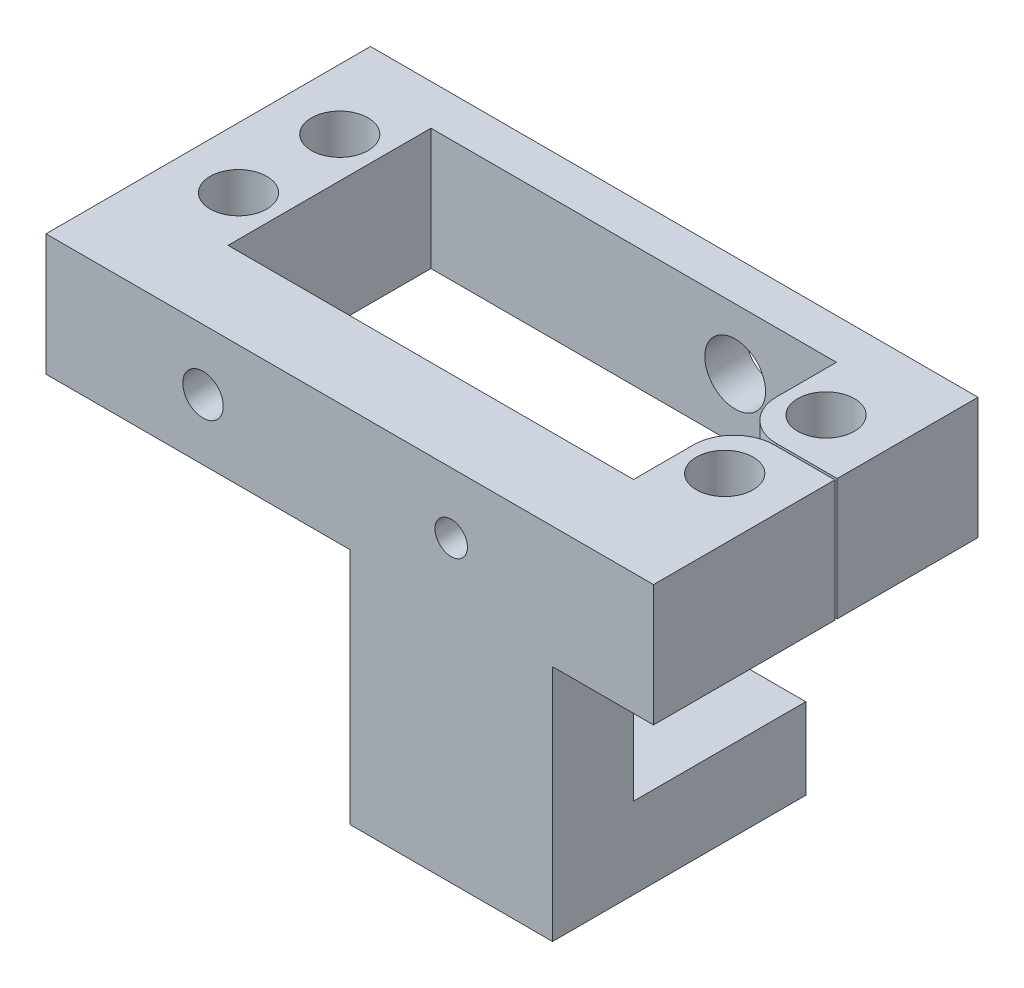
ISO-10303-21;
HEADER;
FILE_DESCRIPTION(('STEP AP214'),'2;1');
FILE_NAME('part.step','',(''),(''),'','','');
FILE_SCHEMA(('AUTOMOTIVE_DESIGN { 1 0 10303 214 1 1 1 1 }'));
ENDSEC;
DATA;
#1=APPLICATION_CONTEXT('core data for automotive mechanical design processes');
#2=APPLICATION_PROTOCOL_DEFINITION('international standard','automotive_design',2000,#1);
#3=PRODUCT_CONTEXT('',#1,'mechanical');
#4=PRODUCT('Part','Part','',(#3));
#5=PRODUCT_RELATED_PRODUCT_CATEGORY('part','',(#4));
#6=PRODUCT_DEFINITION_FORMATION('','',#4);
#7=PRODUCT_DEFINITION_CONTEXT('part definition',#1,'design');
#8=PRODUCT_DEFINITION('design','',#6,#7);
#9=PRODUCT_DEFINITION_SHAPE('','',#8);
#10=(LENGTH_UNIT() NAMED_UNIT(*) SI_UNIT(.MILLI.,.METRE.));
#11=(NAMED_UNIT(*) PLANE_ANGLE_UNIT() SI_UNIT($,.RADIAN.));
#12=(NAMED_UNIT(*) SI_UNIT($,.STERADIAN.) SOLID_ANGLE_UNIT());
#13=UNCERTAINTY_MEASURE_WITH_UNIT(LENGTH_MEASURE(1.E-05),#10,'distance_accuracy_value','');
#14=(GEOMETRIC_REPRESENTATION_CONTEXT(3) GLOBAL_UNCERTAINTY_ASSIGNED_CONTEXT((#13)) GLOBAL_UNIT_ASSIGNED_CONTEXT((#10,
#11,#12)) REPRESENTATION_CONTEXT('',''));
#15=CARTESIAN_POINT('',(0.,0.,0.));
#16=DIRECTION('',(0.,0.,1.));
#17=DIRECTION('',(1.,0.,0.));
#18=AXIS2_PLACEMENT_3D('',#15,#16,#17);
#19=CARTESIAN_POINT('',(0.,-6.,0.));
#20=DIRECTION('',(0.,1.,0.));
#21=DIRECTION('',(0.,0.,1.));
#22=AXIS2_PLACEMENT_3D('',#19,#20,#21);
#23=PLANE('',#22);
#24=DIRECTION('',(1.,0.,0.));
#25=VECTOR('',#24,1.);
#26=CARTESIAN_POINT('',(0.,-6.,18.015));
#27=LINE('',#26,#25);
#28=CARTESIAN_POINT('',(20.015,-6.,18.015));
#29=VERTEX_POINT('',#28);
#30=CARTESIAN_POINT('',(29.985,-6.,18.015));
#31=VERTEX_POINT('',#30);
#32=EDGE_CURVE('E200',#29,#31,#27,.T.);
#33=ORIENTED_EDGE('',*,*,#32,.F.);
#34=DIRECTION('',(0.,0.,-1.));
#35=VECTOR('',#34,1.);
#36=CARTESIAN_POINT('',(20.015,-6.,18.015));
#37=LINE('',#36,#35);
#38=CARTESIAN_POINT('',(20.015,-6.,10.015));
#39=VERTEX_POINT('',#38);
#40=EDGE_CURVE('E380',#29,#39,#37,.T.);
#41=ORIENTED_EDGE('',*,*,#40,.T.);
#42=DIRECTION('',(0.,0.,-1.));
#43=VECTOR('',#42,1.);
#44=CARTESIAN_POINT('',(20.015,-6.,0.));
#45=LINE('',#44,#43);
#46=CARTESIAN_POINT('',(20.015,-6.,4.1));
#47=VERTEX_POINT('',#46);
#48=EDGE_CURVE('E213',#39,#47,#45,.T.);
#49=ORIENTED_EDGE('',*,*,#48,.T.);
#50=CARTESIAN_POINT('',(24.,-6.,4.1));
#51=DIRECTION('',(0.,1.,0.));
#52=DIRECTION('',(0.,0.,1.));
#53=AXIS2_PLACEMENT_3D('',#50,#51,#52);
#54=CIRCLE('',#53,3.985);
#55=CARTESIAN_POINT('',(24.,-6.,0.115000000000004));
#56=VERTEX_POINT('',#55);
#57=EDGE_CURVE('E210',#47,#56,#54,.F.);
#58=ORIENTED_EDGE('',*,*,#57,.T.);
#59=DIRECTION('',(-1.,0.,0.));
#60=VECTOR('',#59,1.);
#61=CARTESIAN_POINT('',(0.,-6.,0.115000000000002));
#62=LINE('',#61,#60);
#63=CARTESIAN_POINT('',(29.985,-6.,0.115000000000006));
#64=VERTEX_POINT('',#63);
#65=EDGE_CURVE('E207',#64,#56,#62,.T.);
#66=ORIENTED_EDGE('',*,*,#65,.F.);
#67=DIRECTION('',(0.,0.,-1.));
#68=VECTOR('',#67,1.);
#69=CARTESIAN_POINT('',(29.985,-6.,0.));
#70=LINE('',#69,#68);
#71=EDGE_CURVE('E205',#31,#64,#70,.T.);
#72=ORIENTED_EDGE('',*,*,#71,.F.);
#73=EDGE_LOOP('',(#33,#41,#49,#58,#66,#72));
#74=FACE_BOUND('',#73,.T.);
#75=ADVANCED_FACE('F41',(#74),#23,.F.);
#76=CARTESIAN_POINT('',(10.015,0.,8.015));
#77=DIRECTION('',(0.,0.,1.));
#78=DIRECTION('',(1.,0.,0.));
#79=AXIS2_PLACEMENT_3D('',#76,#77,#78);
#80=CYLINDRICAL_SURFACE('',#79,1.6);
#81=CARTESIAN_POINT('',(10.015,0.,18.015));
#82=DIRECTION('',(0.,0.,1.));
#83=DIRECTION('',(1.,0.,0.));
#84=AXIS2_PLACEMENT_3D('',#81,#82,#83);
#85=CIRCLE('',#84,1.6);
#86=CARTESIAN_POINT('',(11.615,0.,18.015));
#87=VERTEX_POINT('',#86);
#88=EDGE_CURVE('E201',#87,#87,#85,.T.);
#89=ORIENTED_EDGE('',*,*,#88,.T.);
#90=EDGE_LOOP('',(#89));
#91=FACE_BOUND('',#90,.T.);
#92=CARTESIAN_POINT('',(10.015,0.,14.015));
#93=DIRECTION('',(0.,0.,-1.));
#94=DIRECTION('',(-1.,0.,0.));
#95=AXIS2_PLACEMENT_3D('',#92,#93,#94);
#96=CIRCLE('',#95,1.6);
#97=CARTESIAN_POINT('',(8.415,0.,14.015));
#98=VERTEX_POINT('',#97);
#99=EDGE_CURVE('E45',#98,#98,#96,.F.);
#100=ORIENTED_EDGE('',*,*,#99,.F.);
#101=EDGE_LOOP('',(#100));
#102=FACE_BOUND('',#101,.T.);
#103=ADVANCED_FACE('F301',(#91,#102),#80,.F.);
#104=CARTESIAN_POINT('',(-29.985,6.,0.));
#105=DIRECTION('',(1.,0.,0.));
#106=DIRECTION('',(0.,0.,-1.));
#107=AXIS2_PLACEMENT_3D('',#104,#105,#106);
#108=PLANE('',#107);
#109=DIRECTION('',(0.,0.,1.));
#110=VECTOR('',#109,1.);
#111=CARTESIAN_POINT('',(-29.985,-6.,0.));
#112=LINE('',#111,#110);
#113=CARTESIAN_POINT('',(-29.985,-6.,-14.015));
#114=VERTEX_POINT('',#113);
#115=CARTESIAN_POINT('',(-29.985,-6.,18.015));
#116=VERTEX_POINT('',#115);
#117=EDGE_CURVE('E197',#114,#116,#112,.T.);
#118=ORIENTED_EDGE('',*,*,#117,.T.);
#119=DIRECTION('',(0.,-1.,0.));
#120=VECTOR('',#119,1.);
#121=CARTESIAN_POINT('',(-29.985,6.,18.015));
#122=LINE('',#121,#120);
#123=CARTESIAN_POINT('',(-29.985,6.,18.015));
#124=VERTEX_POINT('',#123);
#125=EDGE_CURVE('E258',#124,#116,#122,.T.);
#126=ORIENTED_EDGE('',*,*,#125,.F.);
#127=DIRECTION('',(0.,0.,1.));
#128=VECTOR('',#127,1.);
#129=CARTESIAN_POINT('',(-29.985,6.,0.));
#130=LINE('',#129,#128);
#131=CARTESIAN_POINT('',(-29.985,6.,-14.015));
#132=VERTEX_POINT('',#131);
#133=EDGE_CURVE('E232',#132,#124,#130,.T.);
#134=ORIENTED_EDGE('',*,*,#133,.F.);
#135=DIRECTION('',(0.,-1.,0.));
#136=VECTOR('',#135,1.);
#137=CARTESIAN_POINT('',(-29.985,6.,-14.015));
#138=LINE('',#137,#136);
#139=EDGE_CURVE('E196',#132,#114,#138,.T.);
#140=ORIENTED_EDGE('',*,*,#139,.T.);
#141=EDGE_LOOP('',(#118,#126,#134,#140));
#142=FACE_BOUND('',#141,.T.);
#143=ADVANCED_FACE('F43',(#142),#108,.F.);
#144=CARTESIAN_POINT('',(0.,6.,18.015));
#145=DIRECTION('',(0.,0.,-1.));
#146=DIRECTION('',(-1.,0.,0.));
#147=AXIS2_PLACEMENT_3D('',#144,#145,#146);
#148=PLANE('',#147);
#149=CARTESIAN_POINT('',(-14.485,0.,18.015));
#150=DIRECTION('',(0.,0.,-1.));
#151=DIRECTION('',(-1.,0.,0.));
#152=AXIS2_PLACEMENT_3D('',#149,#150,#151);
#153=CIRCLE('',#152,2.);
#154=CARTESIAN_POINT('',(-16.485,0.,18.015));
#155=VERTEX_POINT('',#154);
#156=EDGE_CURVE('E424',#155,#155,#153,.F.);
#157=ORIENTED_EDGE('',*,*,#156,.F.);
#158=EDGE_LOOP('',(#157));
#159=FACE_BOUND('',#158,.T.);
#160=ORIENTED_EDGE('',*,*,#88,.F.);
#161=EDGE_LOOP('',(#160));
#162=FACE_BOUND('',#161,.T.);
#163=CARTESIAN_POINT('',(0.,-6.,18.015));
#164=VERTEX_POINT('',#163);
#165=EDGE_CURVE('E202',#116,#164,#27,.T.);
#166=ORIENTED_EDGE('',*,*,#165,.T.);
#167=DIRECTION('',(0.,-1.,0.));
#168=VECTOR('',#167,1.);
#169=CARTESIAN_POINT('',(0.,-29.5,18.015));
#170=LINE('',#169,#168);
#171=CARTESIAN_POINT('',(0.,-29.5,18.015));
#172=VERTEX_POINT('',#171);
#173=EDGE_CURVE('E57',#164,#172,#170,.T.);
#174=ORIENTED_EDGE('',*,*,#173,.T.);
#175=DIRECTION('',(-1.,0.,0.));
#176=VECTOR('',#175,1.);
#177=CARTESIAN_POINT('',(54.3260769285955,-29.5,18.015));
#178=LINE('',#177,#176);
#179=CARTESIAN_POINT('',(20.015,-29.5,18.015));
#180=VERTEX_POINT('',#179);
#181=EDGE_CURVE('E384',#180,#172,#178,.T.);
#182=ORIENTED_EDGE('',*,*,#181,.F.);
#183=DIRECTION('',(0.,1.,0.));
#184=VECTOR('',#183,1.);
#185=CARTESIAN_POINT('',(20.015,-29.5,18.015));
#186=LINE('',#185,#184);
#187=EDGE_CURVE('E379',#180,#29,#186,.T.);
#188=ORIENTED_EDGE('',*,*,#187,.T.);
#189=ORIENTED_EDGE('',*,*,#32,.T.);
#190=DIRECTION('',(0.,-1.,0.));
#191=VECTOR('',#190,1.);
#192=CARTESIAN_POINT('',(29.985,6.,18.015));
#193=LINE('',#192,#191);
#194=CARTESIAN_POINT('',(29.985,6.,18.015));
#195=VERTEX_POINT('',#194);
#196=EDGE_CURVE('E255',#195,#31,#193,.T.);
#197=ORIENTED_EDGE('',*,*,#196,.F.);
#198=DIRECTION('',(1.,0.,0.));
#199=VECTOR('',#198,1.);
#200=CARTESIAN_POINT('',(0.,6.,18.015));
#201=LINE('',#200,#199);
#202=EDGE_CURVE('E123',#124,#195,#201,.T.);
#203=ORIENTED_EDGE('',*,*,#202,.F.);
#204=ORIENTED_EDGE('',*,*,#125,.T.);
#205=EDGE_LOOP('',(#166,#174,#182,#188,#189,#197,#203,#204));
#206=FACE_BOUND('',#205,.T.);
#207=ADVANCED_FACE('F442',(#159,#162,#206),#148,.F.);
#208=CARTESIAN_POINT('',(29.985,6.,0.));
#209=DIRECTION('',(-1.,0.,0.));
#210=DIRECTION('',(0.,0.,1.));
#211=AXIS2_PLACEMENT_3D('',#208,#209,#210);
#212=PLANE('',#211);
#213=ORIENTED_EDGE('',*,*,#71,.T.);
#214=DIRECTION('',(0.,-1.,0.));
#215=VECTOR('',#214,1.);
#216=CARTESIAN_POINT('',(29.985,6.,0.115000000000006));
#217=LINE('',#216,#215);
#218=CARTESIAN_POINT('',(29.985,6.,0.115000000000006));
#219=VERTEX_POINT('',#218);
#220=EDGE_CURVE('E252',#219,#64,#217,.T.);
#221=ORIENTED_EDGE('',*,*,#220,.F.);
#222=DIRECTION('',(0.,0.,-1.));
#223=VECTOR('',#222,1.);
#224=CARTESIAN_POINT('',(29.985,6.,0.));
#225=LINE('',#224,#223);
#226=EDGE_CURVE('E359',#195,#219,#225,.T.);
#227=ORIENTED_EDGE('',*,*,#226,.F.);
#228=ORIENTED_EDGE('',*,*,#196,.T.);
#229=EDGE_LOOP('',(#213,#221,#227,#228));
#230=FACE_BOUND('',#229,.T.);
#231=ADVANCED_FACE('F445',(#230),#212,.F.);
#232=CARTESIAN_POINT('',(0.,6.,0.115000000000002));
#233=DIRECTION('',(0.,0.,1.));
#234=DIRECTION('',(1.,0.,0.));
#235=AXIS2_PLACEMENT_3D('',#232,#233,#234);
#236=PLANE('',#235);
#237=ORIENTED_EDGE('',*,*,#65,.T.);
#238=DIRECTION('',(0.,-1.,0.));
#239=VECTOR('',#238,1.);
#240=CARTESIAN_POINT('',(24.,6.,0.115000000000004));
#241=LINE('',#240,#239);
#242=CARTESIAN_POINT('',(24.,6.,0.115000000000004));
#243=VERTEX_POINT('',#242);
#244=EDGE_CURVE('E250',#243,#56,#241,.T.);
#245=ORIENTED_EDGE('',*,*,#244,.F.);
#246=DIRECTION('',(-1.,0.,0.));
#247=VECTOR('',#246,1.);
#248=CARTESIAN_POINT('',(0.,6.,0.115000000000002));
#249=LINE('',#248,#247);
#250=EDGE_CURVE('E356',#219,#243,#249,.T.);
#251=ORIENTED_EDGE('',*,*,#250,.F.);
#252=ORIENTED_EDGE('',*,*,#220,.T.);
#253=EDGE_LOOP('',(#237,#245,#251,#252));
#254=FACE_BOUND('',#253,.T.);
#255=ADVANCED_FACE('F461',(#254),#236,.F.);
#256=CARTESIAN_POINT('',(24.,6.,4.1));
#257=DIRECTION('',(0.,-1.,0.));
#258=DIRECTION('',(0.,0.,-1.));
#259=AXIS2_PLACEMENT_3D('',#256,#257,#258);
#260=CYLINDRICAL_SURFACE('',#259,3.985);
#261=ORIENTED_EDGE('',*,*,#57,.F.);
#262=DIRECTION('',(0.,-1.,0.));
#263=VECTOR('',#262,1.);
#264=CARTESIAN_POINT('',(20.015,6.,4.1));
#265=LINE('',#264,#263);
#266=CARTESIAN_POINT('',(20.015,6.,4.1));
#267=VERTEX_POINT('',#266);
#268=EDGE_CURVE('E248',#267,#47,#265,.T.);
#269=ORIENTED_EDGE('',*,*,#268,.F.);
#270=CARTESIAN_POINT('',(24.,6.,4.1));
#271=DIRECTION('',(0.,1.,0.));
#272=DIRECTION('',(0.,0.,1.));
#273=AXIS2_PLACEMENT_3D('',#270,#271,#272);
#274=CIRCLE('',#273,3.985);
#275=EDGE_CURVE('E352',#267,#243,#274,.F.);
#276=ORIENTED_EDGE('',*,*,#275,.T.);
#277=ORIENTED_EDGE('',*,*,#244,.T.);
#278=EDGE_LOOP('',(#261,#269,#276,#277));
#279=FACE_BOUND('',#278,.T.);
#280=ADVANCED_FACE('F561',(#279),#260,.T.);
#281=CARTESIAN_POINT('',(20.015,6.,0.));
#282=DIRECTION('',(-1.,0.,0.));
#283=DIRECTION('',(0.,0.,1.));
#284=AXIS2_PLACEMENT_3D('',#281,#282,#283);
#285=PLANE('',#284);
#286=ORIENTED_EDGE('',*,*,#48,.F.);
#287=DIRECTION('',(0.,-1.,0.));
#288=VECTOR('',#287,1.);
#289=CARTESIAN_POINT('',(20.015,6.,10.015));
#290=LINE('',#289,#288);
#291=CARTESIAN_POINT('',(20.015,6.,10.015));
#292=VERTEX_POINT('',#291);
#293=EDGE_CURVE('E245',#292,#39,#290,.T.);
#294=ORIENTED_EDGE('',*,*,#293,.F.);
#295=DIRECTION('',(0.,0.,-1.));
#296=VECTOR('',#295,1.);
#297=CARTESIAN_POINT('',(20.015,6.,0.));
#298=LINE('',#297,#296);
#299=EDGE_CURVE('E345',#292,#267,#298,.T.);
#300=ORIENTED_EDGE('',*,*,#299,.T.);
#301=ORIENTED_EDGE('',*,*,#268,.T.);
#302=EDGE_LOOP('',(#286,#294,#300,#301));
#303=FACE_BOUND('',#302,.T.);
#304=ADVANCED_FACE('F467',(#303),#285,.T.);
#305=CARTESIAN_POINT('',(0.,6.,10.015));
#306=DIRECTION('',(0.,0.,1.));
#307=DIRECTION('',(1.,0.,0.));
#308=AXIS2_PLACEMENT_3D('',#305,#306,#307);
#309=PLANE('',#308);
#310=CARTESIAN_POINT('',(-14.485,0.,10.015));
#311=DIRECTION('',(0.,0.,1.));
#312=DIRECTION('',(1.,0.,0.));
#313=AXIS2_PLACEMENT_3D('',#310,#311,#312);
#314=CIRCLE('',#313,2.);
#315=CARTESIAN_POINT('',(-16.485,0.,10.015));
#316=VERTEX_POINT('',#315);
#317=EDGE_CURVE('E429',#316,#316,#314,.T.);
#318=ORIENTED_EDGE('',*,*,#317,.T.);
#319=EDGE_LOOP('',(#318));
#320=FACE_BOUND('',#319,.T.);
#321=CARTESIAN_POINT('',(10.015,0.,10.015));
#322=DIRECTION('',(0.,0.,1.));
#323=DIRECTION('',(1.,0.,0.));
#324=AXIS2_PLACEMENT_3D('',#321,#322,#323);
#325=CIRCLE('',#324,3.);
#326=CARTESIAN_POINT('',(13.015,0.,10.015));
#327=VERTEX_POINT('',#326);
#328=EDGE_CURVE('E367',#327,#327,#325,.T.);
#329=ORIENTED_EDGE('',*,*,#328,.T.);
#330=EDGE_LOOP('',(#329));
#331=FACE_BOUND('',#330,.T.);
#332=ORIENTED_EDGE('',*,*,#293,.T.);
#333=DIRECTION('',(0.,-1.,0.));
#334=VECTOR('',#333,1.);
#335=CARTESIAN_POINT('',(20.015,-6.,10.015));
#336=LINE('',#335,#334);
#337=CARTESIAN_POINT('',(20.015,-21.5,10.015));
#338=VERTEX_POINT('',#337);
#339=EDGE_CURVE('E383',#39,#338,#336,.T.);
#340=ORIENTED_EDGE('',*,*,#339,.T.);
#341=DIRECTION('',(-1.,0.,0.));
#342=VECTOR('',#341,1.);
#343=CARTESIAN_POINT('',(54.3260769285955,-21.5,10.015));
#344=LINE('',#343,#342);
#345=CARTESIAN_POINT('',(0.,-21.5,10.015));
#346=VERTEX_POINT('',#345);
#347=EDGE_CURVE('E393',#338,#346,#344,.T.);
#348=ORIENTED_EDGE('',*,*,#347,.T.);
#349=DIRECTION('',(0.,1.,0.));
#350=VECTOR('',#349,1.);
#351=CARTESIAN_POINT('',(0.,-6.,10.015));
#352=LINE('',#351,#350);
#353=CARTESIAN_POINT('',(0.,-6.,10.015));
#354=VERTEX_POINT('',#353);
#355=EDGE_CURVE('E333',#346,#354,#352,.T.);
#356=ORIENTED_EDGE('',*,*,#355,.T.);
#357=DIRECTION('',(-1.,0.,0.));
#358=VECTOR('',#357,1.);
#359=CARTESIAN_POINT('',(0.,-6.,10.015));
#360=LINE('',#359,#358);
#361=CARTESIAN_POINT('',(-20.015,-6.,10.015));
#362=VERTEX_POINT('',#361);
#363=EDGE_CURVE('E216',#354,#362,#360,.T.);
#364=ORIENTED_EDGE('',*,*,#363,.T.);
#365=DIRECTION('',(0.,-1.,0.));
#366=VECTOR('',#365,1.);
#367=CARTESIAN_POINT('',(-20.015,6.,10.015));
#368=LINE('',#367,#366);
#369=CARTESIAN_POINT('',(-20.015,6.,10.015));
#370=VERTEX_POINT('',#369);
#371=EDGE_CURVE('E242',#370,#362,#368,.T.);
#372=ORIENTED_EDGE('',*,*,#371,.F.);
#373=DIRECTION('',(-1.,0.,0.));
#374=VECTOR('',#373,1.);
#375=CARTESIAN_POINT('',(0.,6.,10.015));
#376=LINE('',#375,#374);
#377=EDGE_CURVE('E341',#292,#370,#376,.T.);
#378=ORIENTED_EDGE('',*,*,#377,.F.);
#379=EDGE_LOOP('',(#332,#340,#348,#356,#364,#372,#378));
#380=FACE_BOUND('',#379,.T.);
#381=ADVANCED_FACE('F328',(#320,#331,#380),#309,.F.);
#382=CARTESIAN_POINT('',(-20.015,6.,0.));
#383=DIRECTION('',(-1.,0.,0.));
#384=DIRECTION('',(0.,0.,1.));
#385=AXIS2_PLACEMENT_3D('',#382,#383,#384);
#386=PLANE('',#385);
#387=DIRECTION('',(0.,0.,-1.));
#388=VECTOR('',#387,1.);
#389=CARTESIAN_POINT('',(-20.015,-6.,0.));
#390=LINE('',#389,#388);
#391=CARTESIAN_POINT('',(-20.015,-6.,-10.015));
#392=VERTEX_POINT('',#391);
#393=EDGE_CURVE('E219',#362,#392,#390,.T.);
#394=ORIENTED_EDGE('',*,*,#393,.T.);
#395=DIRECTION('',(0.,-1.,0.));
#396=VECTOR('',#395,1.);
#397=CARTESIAN_POINT('',(-20.015,6.,-10.015));
#398=LINE('',#397,#396);
#399=CARTESIAN_POINT('',(-20.015,6.,-10.015));
#400=VERTEX_POINT('',#399);
#401=EDGE_CURVE('E240',#400,#392,#398,.T.);
#402=ORIENTED_EDGE('',*,*,#401,.F.);
#403=DIRECTION('',(0.,0.,-1.));
#404=VECTOR('',#403,1.);
#405=CARTESIAN_POINT('',(-20.015,6.,0.));
#406=LINE('',#405,#404);
#407=EDGE_CURVE('E337',#370,#400,#406,.T.);
#408=ORIENTED_EDGE('',*,*,#407,.F.);
#409=ORIENTED_EDGE('',*,*,#371,.T.);
#410=EDGE_LOOP('',(#394,#402,#408,#409));
#411=FACE_BOUND('',#410,.T.);
#412=ADVANCED_FACE('F335',(#411),#386,.F.);
#413=CARTESIAN_POINT('',(0.,6.,-10.015));
#414=DIRECTION('',(0.,0.,1.));
#415=DIRECTION('',(1.,0.,0.));
#416=AXIS2_PLACEMENT_3D('',#413,#414,#415);
#417=PLANE('',#416);
#418=CARTESIAN_POINT('',(10.015,0.,-10.015));
#419=DIRECTION('',(0.,0.,1.));
#420=DIRECTION('',(1.,0.,0.));
#421=AXIS2_PLACEMENT_3D('',#418,#419,#420);
#422=CIRCLE('',#421,3.);
#423=CARTESIAN_POINT('',(13.015,0.,-10.015));
#424=VERTEX_POINT('',#423);
#425=EDGE_CURVE('E370',#424,#424,#422,.T.);
#426=ORIENTED_EDGE('',*,*,#425,.F.);
#427=EDGE_LOOP('',(#426));
#428=FACE_BOUND('',#427,.T.);
#429=DIRECTION('',(-1.,0.,0.));
#430=VECTOR('',#429,1.);
#431=CARTESIAN_POINT('',(0.,-6.,-10.015));
#432=LINE('',#431,#430);
#433=CARTESIAN_POINT('',(20.015,-6.,-10.015));
#434=VERTEX_POINT('',#433);
#435=EDGE_CURVE('E222',#434,#392,#432,.T.);
#436=ORIENTED_EDGE('',*,*,#435,.F.);
#437=DIRECTION('',(0.,-1.,0.));
#438=VECTOR('',#437,1.);
#439=CARTESIAN_POINT('',(20.015,6.,-10.015));
#440=LINE('',#439,#438);
#441=CARTESIAN_POINT('',(20.015,6.,-10.015));
#442=VERTEX_POINT('',#441);
#443=EDGE_CURVE('E238',#442,#434,#440,.T.);
#444=ORIENTED_EDGE('',*,*,#443,.F.);
#445=DIRECTION('',(-1.,0.,0.));
#446=VECTOR('',#445,1.);
#447=CARTESIAN_POINT('',(0.,6.,-10.015));
#448=LINE('',#447,#446);
#449=EDGE_CURVE('E340',#442,#400,#448,.T.);
#450=ORIENTED_EDGE('',*,*,#449,.T.);
#451=ORIENTED_EDGE('',*,*,#401,.T.);
#452=EDGE_LOOP('',(#436,#444,#450,#451));
#453=FACE_BOUND('',#452,.T.);
#454=ADVANCED_FACE('F553',(#428,#453),#417,.T.);
#455=CARTESIAN_POINT('',(20.015,-6.,-4.1));
#456=VERTEX_POINT('',#455);
#457=EDGE_CURVE('E217',#456,#434,#45,.T.);
#458=ORIENTED_EDGE('',*,*,#457,.F.);
#459=DIRECTION('',(0.,-1.,0.));
#460=VECTOR('',#459,1.);
#461=CARTESIAN_POINT('',(20.015,6.,-4.1));
#462=LINE('',#461,#460);
#463=CARTESIAN_POINT('',(20.015,6.,-4.1));
#464=VERTEX_POINT('',#463);
#465=EDGE_CURVE('E236',#464,#456,#462,.T.);
#466=ORIENTED_EDGE('',*,*,#465,.F.);
#467=EDGE_CURVE('E343',#464,#442,#298,.T.);
#468=ORIENTED_EDGE('',*,*,#467,.T.);
#469=ORIENTED_EDGE('',*,*,#443,.T.);
#470=EDGE_LOOP('',(#458,#466,#468,#469));
#471=FACE_BOUND('',#470,.T.);
#472=ADVANCED_FACE('F549',(#471),#285,.T.);
#473=CARTESIAN_POINT('',(24.,6.,-4.1));
#474=DIRECTION('',(0.,-1.,0.));
#475=DIRECTION('',(0.,0.,-1.));
#476=AXIS2_PLACEMENT_3D('',#473,#474,#475);
#477=CYLINDRICAL_SURFACE('',#476,3.985);
#478=CARTESIAN_POINT('',(24.,-6.,-4.1));
#479=DIRECTION('',(0.,1.,0.));
#480=DIRECTION('',(0.,0.,1.));
#481=AXIS2_PLACEMENT_3D('',#478,#479,#480);
#482=CIRCLE('',#481,3.985);
#483=CARTESIAN_POINT('',(24.,-6.,-0.115000000000005));
#484=VERTEX_POINT('',#483);
#485=EDGE_CURVE('E225',#456,#484,#482,.T.);
#486=ORIENTED_EDGE('',*,*,#485,.T.);
#487=DIRECTION('',(0.,-1.,0.));
#488=VECTOR('',#487,1.);
#489=CARTESIAN_POINT('',(24.,6.,-0.115000000000005));
#490=LINE('',#489,#488);
#491=CARTESIAN_POINT('',(24.,6.,-0.115000000000005));
#492=VERTEX_POINT('',#491);
#493=EDGE_CURVE('E168',#492,#484,#490,.T.);
#494=ORIENTED_EDGE('',*,*,#493,.F.);
#495=CARTESIAN_POINT('',(24.,6.,-4.1));
#496=DIRECTION('',(0.,1.,0.));
#497=DIRECTION('',(0.,0.,1.));
#498=AXIS2_PLACEMENT_3D('',#495,#496,#497);
#499=CIRCLE('',#498,3.985);
#500=EDGE_CURVE('E176',#464,#492,#499,.T.);
#501=ORIENTED_EDGE('',*,*,#500,.F.);
#502=ORIENTED_EDGE('',*,*,#465,.T.);
#503=EDGE_LOOP('',(#486,#494,#501,#502));
#504=FACE_BOUND('',#503,.T.);
#505=ADVANCED_FACE('F546',(#504),#477,.T.);
#506=CARTESIAN_POINT('',(0.,6.,-0.115000000000002));
#507=DIRECTION('',(0.,0.,1.));
#508=DIRECTION('',(1.,0.,0.));
#509=AXIS2_PLACEMENT_3D('',#506,#507,#508);
#510=PLANE('',#509);
#511=DIRECTION('',(-1.,0.,0.));
#512=VECTOR('',#511,1.);
#513=CARTESIAN_POINT('',(0.,-6.,-0.115000000000002));
#514=LINE('',#513,#512);
#515=CARTESIAN_POINT('',(29.985,-6.,-0.115000000000006));
#516=VERTEX_POINT('',#515);
#517=EDGE_CURVE('E163',#516,#484,#514,.T.);
#518=ORIENTED_EDGE('',*,*,#517,.F.);
#519=DIRECTION('',(0.,-1.,0.));
#520=VECTOR('',#519,1.);
#521=CARTESIAN_POINT('',(29.985,6.,-0.115000000000006));
#522=LINE('',#521,#520);
#523=CARTESIAN_POINT('',(29.985,6.,-0.115000000000006));
#524=VERTEX_POINT('',#523);
#525=EDGE_CURVE('E158',#524,#516,#522,.T.);
#526=ORIENTED_EDGE('',*,*,#525,.F.);
#527=DIRECTION('',(-1.,0.,0.));
#528=VECTOR('',#527,1.);
#529=CARTESIAN_POINT('',(0.,6.,-0.115000000000002));
#530=LINE('',#529,#528);
#531=EDGE_CURVE('E161',#524,#492,#530,.T.);
#532=ORIENTED_EDGE('',*,*,#531,.T.);
#533=ORIENTED_EDGE('',*,*,#493,.T.);
#534=EDGE_LOOP('',(#518,#526,#532,#533));
#535=FACE_BOUND('',#534,.T.);
#536=ADVANCED_FACE('F160',(#535),#510,.T.);
#537=CARTESIAN_POINT('',(29.985,6.,0.));
#538=DIRECTION('',(1.,0.,0.));
#539=DIRECTION('',(0.,0.,-1.));
#540=AXIS2_PLACEMENT_3D('',#537,#538,#539);
#541=PLANE('',#540);
#542=DIRECTION('',(0.,0.,1.));
#543=VECTOR('',#542,1.);
#544=CARTESIAN_POINT('',(29.985,-6.,0.));
#545=LINE('',#544,#543);
#546=CARTESIAN_POINT('',(29.985,-6.,-14.015));
#547=VERTEX_POINT('',#546);
#548=EDGE_CURVE('E229',#547,#516,#545,.T.);
#549=ORIENTED_EDGE('',*,*,#548,.F.);
#550=DIRECTION('',(0.,-1.,0.));
#551=VECTOR('',#550,1.);
#552=CARTESIAN_POINT('',(29.985,6.,-14.015));
#553=LINE('',#552,#551);
#554=CARTESIAN_POINT('',(29.985,6.,-14.015));
#555=VERTEX_POINT('',#554);
#556=EDGE_CURVE('E169',#555,#547,#553,.T.);
#557=ORIENTED_EDGE('',*,*,#556,.F.);
#558=DIRECTION('',(0.,0.,1.));
#559=VECTOR('',#558,1.);
#560=CARTESIAN_POINT('',(29.985,6.,0.));
#561=LINE('',#560,#559);
#562=EDGE_CURVE('E173',#555,#524,#561,.T.);
#563=ORIENTED_EDGE('',*,*,#562,.T.);
#564=ORIENTED_EDGE('',*,*,#525,.T.);
#565=EDGE_LOOP('',(#549,#557,#563,#564));
#566=FACE_BOUND('',#565,.T.);
#567=ADVANCED_FACE('F179',(#566),#541,.T.);
#568=CARTESIAN_POINT('',(24.,6.,5.));
#569=DIRECTION('',(0.,-1.,0.));
#570=DIRECTION('',(0.,0.,-1.));
#571=AXIS2_PLACEMENT_3D('',#568,#569,#570);
#572=CYLINDRICAL_SURFACE('',#571,2.8);
#573=CARTESIAN_POINT('',(24.,-2.5,5.));
#574=DIRECTION('',(0.,1.,0.));
#575=DIRECTION('',(0.,0.,1.));
#576=AXIS2_PLACEMENT_3D('',#573,#574,#575);
#577=CIRCLE('',#576,2.8);
#578=CARTESIAN_POINT('',(24.,-2.5,7.8));
#579=VERTEX_POINT('',#578);
#580=EDGE_CURVE('E263',#579,#579,#577,.T.);
#581=ORIENTED_EDGE('',*,*,#580,.F.);
#582=EDGE_LOOP('',(#581));
#583=FACE_BOUND('',#582,.T.);
#584=CARTESIAN_POINT('',(24.,6.,5.));
#585=DIRECTION('',(0.,1.,0.));
#586=DIRECTION('',(0.,0.,1.));
#587=AXIS2_PLACEMENT_3D('',#584,#585,#586);
#588=CIRCLE('',#587,2.8);
#589=CARTESIAN_POINT('',(24.,6.,7.8));
#590=VERTEX_POINT('',#589);
#591=EDGE_CURVE('E190',#590,#590,#588,.T.);
#592=ORIENTED_EDGE('',*,*,#591,.T.);
#593=EDGE_LOOP('',(#592));
#594=FACE_BOUND('',#593,.T.);
#595=ADVANCED_FACE('F533',(#583,#594),#572,.F.);
#596=CARTESIAN_POINT('',(-24.,6.,5.));
#597=DIRECTION('',(0.,-1.,0.));
#598=DIRECTION('',(0.,0.,-1.));
#599=AXIS2_PLACEMENT_3D('',#596,#597,#598);
#600=CYLINDRICAL_SURFACE('',#599,2.8);
#601=CARTESIAN_POINT('',(-24.,-2.5,5.));
#602=DIRECTION('',(0.,1.,0.));
#603=DIRECTION('',(0.,0.,1.));
#604=AXIS2_PLACEMENT_3D('',#601,#602,#603);
#605=CIRCLE('',#604,2.8);
#606=CARTESIAN_POINT('',(-24.,-2.5,7.8));
#607=VERTEX_POINT('',#606);
#608=EDGE_CURVE('E12',#607,#607,#605,.T.);
#609=ORIENTED_EDGE('',*,*,#608,.F.);
#610=EDGE_LOOP('',(#609));
#611=FACE_BOUND('',#610,.T.);
#612=CARTESIAN_POINT('',(-24.,6.,5.));
#613=DIRECTION('',(0.,1.,0.));
#614=DIRECTION('',(0.,0.,1.));
#615=AXIS2_PLACEMENT_3D('',#612,#613,#614);
#616=CIRCLE('',#615,2.8);
#617=CARTESIAN_POINT('',(-24.,6.,7.8));
#618=VERTEX_POINT('',#617);
#619=EDGE_CURVE('E187',#618,#618,#616,.T.);
#620=ORIENTED_EDGE('',*,*,#619,.T.);
#621=EDGE_LOOP('',(#620));
#622=FACE_BOUND('',#621,.T.);
#623=ADVANCED_FACE('F275',(#611,#622),#600,.F.);
#624=CARTESIAN_POINT('',(-24.,6.,-5.));
#625=DIRECTION('',(0.,-1.,0.));
#626=DIRECTION('',(0.,0.,-1.));
#627=AXIS2_PLACEMENT_3D('',#624,#625,#626);
#628=CYLINDRICAL_SURFACE('',#627,2.8);
#629=CARTESIAN_POINT('',(-24.,-2.5,-5.));
#630=DIRECTION('',(0.,1.,0.));
#631=DIRECTION('',(0.,0.,1.));
#632=AXIS2_PLACEMENT_3D('',#629,#630,#631);
#633=CIRCLE('',#632,2.8);
#634=CARTESIAN_POINT('',(-24.,-2.5,-2.2));
#635=VERTEX_POINT('',#634);
#636=EDGE_CURVE('E50',#635,#635,#633,.T.);
#637=ORIENTED_EDGE('',*,*,#636,.F.);
#638=EDGE_LOOP('',(#637));
#639=FACE_BOUND('',#638,.T.);
#640=CARTESIAN_POINT('',(-24.,6.,-5.));
#641=DIRECTION('',(0.,1.,0.));
#642=DIRECTION('',(0.,0.,1.));
#643=AXIS2_PLACEMENT_3D('',#640,#641,#642);
#644=CIRCLE('',#643,2.8);
#645=CARTESIAN_POINT('',(-24.,6.,-2.2));
#646=VERTEX_POINT('',#645);
#647=EDGE_CURVE('E181',#646,#646,#644,.T.);
#648=ORIENTED_EDGE('',*,*,#647,.T.);
#649=EDGE_LOOP('',(#648));
#650=FACE_BOUND('',#649,.T.);
#651=ADVANCED_FACE('F271',(#639,#650),#628,.F.);
#652=CARTESIAN_POINT('',(0.,6.,-14.015));
#653=DIRECTION('',(0.,0.,1.));
#654=DIRECTION('',(1.,0.,0.));
#655=AXIS2_PLACEMENT_3D('',#652,#653,#654);
#656=PLANE('',#655);
#657=CARTESIAN_POINT('',(10.015,0.,-14.015));
#658=DIRECTION('',(0.,0.,-1.));
#659=DIRECTION('',(-1.,0.,0.));
#660=AXIS2_PLACEMENT_3D('',#657,#658,#659);
#661=CIRCLE('',#660,3.);
#662=CARTESIAN_POINT('',(7.015,0.,-14.015));
#663=VERTEX_POINT('',#662);
#664=EDGE_CURVE('E376',#663,#663,#661,.T.);
#665=ORIENTED_EDGE('',*,*,#664,.F.);
#666=EDGE_LOOP('',(#665));
#667=FACE_BOUND('',#666,.T.);
#668=DIRECTION('',(-1.,0.,0.));
#669=VECTOR('',#668,1.);
#670=CARTESIAN_POINT('',(0.,-6.,-14.015));
#671=LINE('',#670,#669);
#672=EDGE_CURVE('E114',#547,#114,#671,.T.);
#673=ORIENTED_EDGE('',*,*,#672,.T.);
#674=ORIENTED_EDGE('',*,*,#139,.F.);
#675=DIRECTION('',(-1.,0.,0.));
#676=VECTOR('',#675,1.);
#677=CARTESIAN_POINT('',(0.,6.,-14.015));
#678=LINE('',#677,#676);
#679=EDGE_CURVE('E66',#555,#132,#678,.T.);
#680=ORIENTED_EDGE('',*,*,#679,.F.);
#681=ORIENTED_EDGE('',*,*,#556,.T.);
#682=EDGE_LOOP('',(#673,#674,#680,#681));
#683=FACE_BOUND('',#682,.T.);
#684=ADVANCED_FACE('F274',(#667,#683),#656,.F.);
#685=CARTESIAN_POINT('',(24.,6.,-5.));
#686=DIRECTION('',(0.,-1.,0.));
#687=DIRECTION('',(0.,0.,-1.));
#688=AXIS2_PLACEMENT_3D('',#685,#686,#687);
#689=CYLINDRICAL_SURFACE('',#688,2.8);
#690=CARTESIAN_POINT('',(24.,-2.5,-5.));
#691=DIRECTION('',(0.,1.,0.));
#692=DIRECTION('',(0.,0.,1.));
#693=AXIS2_PLACEMENT_3D('',#690,#691,#692);
#694=CIRCLE('',#693,2.8);
#695=CARTESIAN_POINT('',(24.,-2.5,-2.2));
#696=VERTEX_POINT('',#695);
#697=EDGE_CURVE('E260',#696,#696,#694,.T.);
#698=ORIENTED_EDGE('',*,*,#697,.F.);
#699=EDGE_LOOP('',(#698));
#700=FACE_BOUND('',#699,.T.);
#701=CARTESIAN_POINT('',(24.,6.,-5.));
#702=DIRECTION('',(0.,1.,0.));
#703=DIRECTION('',(0.,0.,1.));
#704=AXIS2_PLACEMENT_3D('',#701,#702,#703);
#705=CIRCLE('',#704,2.8);
#706=CARTESIAN_POINT('',(24.,6.,-2.2));
#707=VERTEX_POINT('',#706);
#708=EDGE_CURVE('E193',#707,#707,#705,.T.);
#709=ORIENTED_EDGE('',*,*,#708,.T.);
#710=EDGE_LOOP('',(#709));
#711=FACE_BOUND('',#710,.T.);
#712=ADVANCED_FACE('F281',(#700,#711),#689,.F.);
#713=CARTESIAN_POINT('',(0.,6.,0.));
#714=DIRECTION('',(0.,1.,0.));
#715=DIRECTION('',(0.,0.,1.));
#716=AXIS2_PLACEMENT_3D('',#713,#714,#715);
#717=PLANE('',#716);
#718=ORIENTED_EDGE('',*,*,#133,.T.);
#719=ORIENTED_EDGE('',*,*,#202,.T.);
#720=ORIENTED_EDGE('',*,*,#226,.T.);
#721=ORIENTED_EDGE('',*,*,#250,.T.);
#722=ORIENTED_EDGE('',*,*,#275,.F.);
#723=ORIENTED_EDGE('',*,*,#299,.F.);
#724=ORIENTED_EDGE('',*,*,#377,.T.);
#725=ORIENTED_EDGE('',*,*,#407,.T.);
#726=ORIENTED_EDGE('',*,*,#449,.F.);
#727=ORIENTED_EDGE('',*,*,#467,.F.);
#728=ORIENTED_EDGE('',*,*,#500,.T.);
#729=ORIENTED_EDGE('',*,*,#531,.F.);
#730=ORIENTED_EDGE('',*,*,#562,.F.);
#731=ORIENTED_EDGE('',*,*,#679,.T.);
#732=EDGE_LOOP('',(#718,#719,#720,#721,#722,#723,#724,#725,#726,#727,#728,#729,#730,#731));
#733=FACE_BOUND('',#732,.T.);
#734=ORIENTED_EDGE('',*,*,#647,.F.);
#735=EDGE_LOOP('',(#734));
#736=FACE_BOUND('',#735,.T.);
#737=ORIENTED_EDGE('',*,*,#619,.F.);
#738=EDGE_LOOP('',(#737));
#739=FACE_BOUND('',#738,.T.);
#740=ORIENTED_EDGE('',*,*,#591,.F.);
#741=EDGE_LOOP('',(#740));
#742=FACE_BOUND('',#741,.T.);
#743=ORIENTED_EDGE('',*,*,#708,.F.);
#744=EDGE_LOOP('',(#743));
#745=FACE_BOUND('',#744,.T.);
#746=ADVANCED_FACE('F171',(#733,#736,#739,#742,#745),#717,.T.);
#747=ORIENTED_EDGE('',*,*,#363,.F.);
#748=DIRECTION('',(0.,0.,1.));
#749=VECTOR('',#748,1.);
#750=CARTESIAN_POINT('',(0.,-6.,18.015));
#751=LINE('',#750,#749);
#752=EDGE_CURVE('E321',#354,#164,#751,.T.);
#753=ORIENTED_EDGE('',*,*,#752,.T.);
#754=ORIENTED_EDGE('',*,*,#165,.F.);
#755=ORIENTED_EDGE('',*,*,#117,.F.);
#756=ORIENTED_EDGE('',*,*,#672,.F.);
#757=ORIENTED_EDGE('',*,*,#548,.T.);
#758=ORIENTED_EDGE('',*,*,#517,.T.);
#759=ORIENTED_EDGE('',*,*,#485,.F.);
#760=ORIENTED_EDGE('',*,*,#457,.T.);
#761=ORIENTED_EDGE('',*,*,#435,.T.);
#762=ORIENTED_EDGE('',*,*,#393,.F.);
#763=EDGE_LOOP('',(#747,#753,#754,#755,#756,#757,#758,#759,#760,#761,#762));
#764=FACE_BOUND('',#763,.T.);
#765=ADVANCED_FACE('F280',(#764),#23,.F.);
#766=CARTESIAN_POINT('',(0.,-2.5,0.));
#767=DIRECTION('',(0.,1.,0.));
#768=DIRECTION('',(0.,0.,1.));
#769=AXIS2_PLACEMENT_3D('',#766,#767,#768);
#770=PLANE('',#769);
#771=ORIENTED_EDGE('',*,*,#697,.T.);
#772=EDGE_LOOP('',(#771));
#773=FACE_BOUND('',#772,.T.);
#774=ADVANCED_FACE('F310',(#773),#770,.T.);
#775=CARTESIAN_POINT('',(0.,-2.5,0.));
#776=DIRECTION('',(0.,1.,0.));
#777=DIRECTION('',(0.,0.,1.));
#778=AXIS2_PLACEMENT_3D('',#775,#776,#777);
#779=PLANE('',#778);
#780=ORIENTED_EDGE('',*,*,#580,.T.);
#781=EDGE_LOOP('',(#780));
#782=FACE_BOUND('',#781,.T.);
#783=ADVANCED_FACE('F315',(#782),#779,.T.);
#784=CARTESIAN_POINT('',(0.,-2.5,0.));
#785=DIRECTION('',(0.,1.,0.));
#786=DIRECTION('',(0.,0.,1.));
#787=AXIS2_PLACEMENT_3D('',#784,#785,#786);
#788=PLANE('',#787);
#789=ORIENTED_EDGE('',*,*,#636,.T.);
#790=EDGE_LOOP('',(#789));
#791=FACE_BOUND('',#790,.T.);
#792=ADVANCED_FACE('F269',(#791),#788,.T.);
#793=CARTESIAN_POINT('',(0.,-2.5,0.));
#794=DIRECTION('',(0.,1.,0.));
#795=DIRECTION('',(0.,0.,1.));
#796=AXIS2_PLACEMENT_3D('',#793,#794,#795);
#797=PLANE('',#796);
#798=ORIENTED_EDGE('',*,*,#608,.T.);
#799=EDGE_LOOP('',(#798));
#800=FACE_BOUND('',#799,.T.);
#801=ADVANCED_FACE('F517',(#800),#797,.T.);
#802=CARTESIAN_POINT('',(0.,6.,14.015));
#803=DIRECTION('',(0.,0.,-1.));
#804=DIRECTION('',(-1.,0.,0.));
#805=AXIS2_PLACEMENT_3D('',#802,#803,#804);
#806=PLANE('',#805);
#807=CARTESIAN_POINT('',(10.015,0.,14.015));
#808=DIRECTION('',(0.,0.,-1.));
#809=DIRECTION('',(-1.,0.,0.));
#810=AXIS2_PLACEMENT_3D('',#807,#808,#809);
#811=CIRCLE('',#810,3.);
#812=CARTESIAN_POINT('',(7.015,0.,14.015));
#813=VERTEX_POINT('',#812);
#814=EDGE_CURVE('E373',#813,#813,#811,.F.);
#815=ORIENTED_EDGE('',*,*,#814,.F.);
#816=EDGE_LOOP('',(#815));
#817=FACE_BOUND('',#816,.T.);
#818=ORIENTED_EDGE('',*,*,#99,.T.);
#819=EDGE_LOOP('',(#818));
#820=FACE_BOUND('',#819,.T.);
#821=ADVANCED_FACE('F513',(#817,#820),#806,.T.);
#822=CARTESIAN_POINT('',(10.015,0.,26.5002813742386));
#823=DIRECTION('',(0.,0.,-1.));
#824=DIRECTION('',(-1.,0.,0.));
#825=AXIS2_PLACEMENT_3D('',#822,#823,#824);
#826=CYLINDRICAL_SURFACE('',#825,3.);
#827=ORIENTED_EDGE('',*,*,#814,.T.);
#828=EDGE_LOOP('',(#827));
#829=FACE_BOUND('',#828,.T.);
#830=ORIENTED_EDGE('',*,*,#328,.F.);
#831=EDGE_LOOP('',(#830));
#832=FACE_BOUND('',#831,.T.);
#833=ADVANCED_FACE('F516',(#829,#832),#826,.F.);
#834=ORIENTED_EDGE('',*,*,#425,.T.);
#835=EDGE_LOOP('',(#834));
#836=FACE_BOUND('',#835,.T.);
#837=ORIENTED_EDGE('',*,*,#664,.T.);
#838=EDGE_LOOP('',(#837));
#839=FACE_BOUND('',#838,.T.);
#840=ADVANCED_FACE('F506',(#836,#839),#826,.F.);
#841=CARTESIAN_POINT('',(0.,0.,0.));
#842=DIRECTION('',(-1.,0.,0.));
#843=DIRECTION('',(0.,0.,1.));
#844=AXIS2_PLACEMENT_3D('',#841,#842,#843);
#845=PLANE('',#844);
#846=ORIENTED_EDGE('',*,*,#173,.F.);
#847=ORIENTED_EDGE('',*,*,#752,.F.);
#848=ORIENTED_EDGE('',*,*,#355,.F.);
#849=DIRECTION('',(0.,0.,1.));
#850=VECTOR('',#849,1.);
#851=CARTESIAN_POINT('',(0.,-21.5,10.015));
#852=LINE('',#851,#850);
#853=CARTESIAN_POINT('',(0.,-21.5,-6.985));
#854=VERTEX_POINT('',#853);
#855=EDGE_CURVE('E397',#854,#346,#852,.T.);
#856=ORIENTED_EDGE('',*,*,#855,.F.);
#857=DIRECTION('',(0.,1.,0.));
#858=VECTOR('',#857,1.);
#859=CARTESIAN_POINT('',(0.,-21.5,-6.985));
#860=LINE('',#859,#858);
#861=CARTESIAN_POINT('',(0.,-29.5,-6.985));
#862=VERTEX_POINT('',#861);
#863=EDGE_CURVE('E400',#862,#854,#860,.T.);
#864=ORIENTED_EDGE('',*,*,#863,.F.);
#865=DIRECTION('',(0.,0.,-1.));
#866=VECTOR('',#865,1.);
#867=CARTESIAN_POINT('',(0.,-29.5,-6.985));
#868=LINE('',#867,#866);
#869=EDGE_CURVE('E403',#172,#862,#868,.T.);
#870=ORIENTED_EDGE('',*,*,#869,.F.);
#871=EDGE_LOOP('',(#846,#847,#848,#856,#864,#870));
#872=FACE_BOUND('',#871,.T.);
#873=ADVANCED_FACE('F495',(#872),#845,.T.);
#874=CARTESIAN_POINT('',(54.3260769285955,-21.5,10.015));
#875=DIRECTION('',(0.,-1.,0.));
#876=DIRECTION('',(0.,0.,-1.));
#877=AXIS2_PLACEMENT_3D('',#874,#875,#876);
#878=PLANE('',#877);
#879=ORIENTED_EDGE('',*,*,#347,.F.);
#880=DIRECTION('',(0.,0.,-1.));
#881=VECTOR('',#880,1.);
#882=CARTESIAN_POINT('',(20.015,-21.5,10.015));
#883=LINE('',#882,#881);
#884=CARTESIAN_POINT('',(20.015,-21.5,-6.98499999999999));
#885=VERTEX_POINT('',#884);
#886=EDGE_CURVE('E416',#338,#885,#883,.T.);
#887=ORIENTED_EDGE('',*,*,#886,.T.);
#888=DIRECTION('',(-1.,0.,0.));
#889=VECTOR('',#888,1.);
#890=CARTESIAN_POINT('',(54.3260769285955,-21.5,-6.985));
#891=LINE('',#890,#889);
#892=EDGE_CURVE('E390',#885,#854,#891,.T.);
#893=ORIENTED_EDGE('',*,*,#892,.T.);
#894=ORIENTED_EDGE('',*,*,#855,.T.);
#895=EDGE_LOOP('',(#879,#887,#893,#894));
#896=FACE_BOUND('',#895,.T.);
#897=ADVANCED_FACE('F498',(#896),#878,.F.);
#898=CARTESIAN_POINT('',(54.3260769285955,-21.5,-6.985));
#899=DIRECTION('',(0.,0.,1.));
#900=DIRECTION('',(0.,-1.,0.));
#901=AXIS2_PLACEMENT_3D('',#898,#899,#900);
#902=PLANE('',#901);
#903=ORIENTED_EDGE('',*,*,#892,.F.);
#904=DIRECTION('',(0.,-1.,0.));
#905=VECTOR('',#904,1.);
#906=CARTESIAN_POINT('',(20.015,-21.5,-6.985));
#907=LINE('',#906,#905);
#908=CARTESIAN_POINT('',(20.015,-29.5,-6.985));
#909=VERTEX_POINT('',#908);
#910=EDGE_CURVE('E413',#885,#909,#907,.T.);
#911=ORIENTED_EDGE('',*,*,#910,.T.);
#912=DIRECTION('',(-1.,0.,0.));
#913=VECTOR('',#912,1.);
#914=CARTESIAN_POINT('',(54.3260769285955,-29.5,-6.985));
#915=LINE('',#914,#913);
#916=EDGE_CURVE('E387',#909,#862,#915,.T.);
#917=ORIENTED_EDGE('',*,*,#916,.T.);
#918=ORIENTED_EDGE('',*,*,#863,.T.);
#919=EDGE_LOOP('',(#903,#911,#917,#918));
#920=FACE_BOUND('',#919,.T.);
#921=ADVANCED_FACE('F492',(#920),#902,.F.);
#922=CARTESIAN_POINT('',(54.3260769285955,-29.5,-6.985));
#923=DIRECTION('',(0.,1.,0.));
#924=DIRECTION('',(0.,0.,1.));
#925=AXIS2_PLACEMENT_3D('',#922,#923,#924);
#926=PLANE('',#925);
#927=CARTESIAN_POINT('',(10.015,-29.5,0.));
#928=DIRECTION('',(0.,-1.,0.));
#929=DIRECTION('',(0.,0.,-1.));
#930=AXIS2_PLACEMENT_3D('',#927,#928,#929);
#931=CIRCLE('',#930,2.);
#932=CARTESIAN_POINT('',(10.015,-29.5,-2.));
#933=VERTEX_POINT('',#932);
#934=EDGE_CURVE('E421',#933,#933,#931,.T.);
#935=ORIENTED_EDGE('',*,*,#934,.F.);
#936=EDGE_LOOP('',(#935));
#937=FACE_BOUND('',#936,.T.);
#938=ORIENTED_EDGE('',*,*,#916,.F.);
#939=DIRECTION('',(0.,0.,1.));
#940=VECTOR('',#939,1.);
#941=CARTESIAN_POINT('',(20.015,-29.5,-6.985));
#942=LINE('',#941,#940);
#943=EDGE_CURVE('E410',#909,#180,#942,.T.);
#944=ORIENTED_EDGE('',*,*,#943,.T.);
#945=ORIENTED_EDGE('',*,*,#181,.T.);
#946=ORIENTED_EDGE('',*,*,#869,.T.);
#947=EDGE_LOOP('',(#938,#944,#945,#946));
#948=FACE_BOUND('',#947,.T.);
#949=ADVANCED_FACE('F480',(#937,#948),#926,.F.);
#950=CARTESIAN_POINT('',(20.015,6.,0.));
#951=DIRECTION('',(-1.,0.,0.));
#952=DIRECTION('',(0.,0.,1.));
#953=AXIS2_PLACEMENT_3D('',#950,#951,#952);
#954=PLANE('',#953);
#955=ORIENTED_EDGE('',*,*,#943,.F.);
#956=ORIENTED_EDGE('',*,*,#910,.F.);
#957=ORIENTED_EDGE('',*,*,#886,.F.);
#958=ORIENTED_EDGE('',*,*,#339,.F.);
#959=ORIENTED_EDGE('',*,*,#40,.F.);
#960=ORIENTED_EDGE('',*,*,#187,.F.);
#961=EDGE_LOOP('',(#955,#956,#957,#958,#959,#960));
#962=FACE_BOUND('',#961,.T.);
#963=ADVANCED_FACE('F474',(#962),#954,.F.);
#964=CARTESIAN_POINT('',(10.015,-23.5,0.));
#965=DIRECTION('',(0.,-1.,0.));
#966=DIRECTION('',(0.,0.,-1.));
#967=AXIS2_PLACEMENT_3D('',#964,#965,#966);
#968=CYLINDRICAL_SURFACE('',#967,2.);
#969=CARTESIAN_POINT('',(10.015,-23.5,0.));
#970=DIRECTION('',(0.,-1.,0.));
#971=DIRECTION('',(0.,0.,-1.));
#972=AXIS2_PLACEMENT_3D('',#969,#970,#971);
#973=CIRCLE('',#972,2.);
#974=CARTESIAN_POINT('',(10.015,-23.5,-2.));
#975=VERTEX_POINT('',#974);
#976=EDGE_CURVE('E407',#975,#975,#973,.T.);
#977=ORIENTED_EDGE('',*,*,#976,.F.);
#978=EDGE_LOOP('',(#977));
#979=FACE_BOUND('',#978,.T.);
#980=ORIENTED_EDGE('',*,*,#934,.T.);
#981=EDGE_LOOP('',(#980));
#982=FACE_BOUND('',#981,.T.);
#983=ADVANCED_FACE('F751',(#979,#982),#968,.F.);
#984=CARTESIAN_POINT('',(10.015,-23.5,0.));
#985=DIRECTION('',(0.,-1.,0.));
#986=DIRECTION('',(0.,0.,-1.));
#987=AXIS2_PLACEMENT_3D('',#984,#985,#986);
#988=PLANE('',#987);
#989=ORIENTED_EDGE('',*,*,#976,.T.);
#990=EDGE_LOOP('',(#989));
#991=FACE_BOUND('',#990,.T.);
#992=ADVANCED_FACE('F438',(#991),#988,.T.);
#993=CARTESIAN_POINT('',(-14.485,0.,18.015012));
#994=DIRECTION('',(0.,0.,-1.));
#995=DIRECTION('',(-1.,0.,0.));
#996=AXIS2_PLACEMENT_3D('',#993,#994,#995);
#997=CYLINDRICAL_SURFACE('',#996,2.);
#998=CARTESIAN_POINT('',(-16.485,0.,10.015));
#999=CARTESIAN_POINT('',(-16.485,0.,10.0983333333333));
#1000=CARTESIAN_POINT('',(-16.485,0.,10.1816666666667));
#1001=CARTESIAN_POINT('',(-16.485,0.,10.3483333333333));
#1002=CARTESIAN_POINT('',(-16.485,0.,10.4316666666667));
#1003=CARTESIAN_POINT('',(-16.485,0.,10.5983333333333));
#1004=CARTESIAN_POINT('',(-16.485,0.,10.6816666666667));
#1005=CARTESIAN_POINT('',(-16.485,0.,10.8483333333333));
#1006=CARTESIAN_POINT('',(-16.485,0.,10.9316666666667));
#1007=CARTESIAN_POINT('',(-16.485,0.,11.0983333333333));
#1008=CARTESIAN_POINT('',(-16.485,0.,11.1816666666667));
#1009=CARTESIAN_POINT('',(-16.485,0.,11.3483333333333));
#1010=CARTESIAN_POINT('',(-16.485,0.,11.4316666666667));
#1011=CARTESIAN_POINT('',(-16.485,0.,11.5983333333333));
#1012=CARTESIAN_POINT('',(-16.485,0.,11.6816666666667));
#1013=CARTESIAN_POINT('',(-16.485,0.,11.8483333333333));
#1014=CARTESIAN_POINT('',(-16.485,0.,11.9316666666667));
#1015=CARTESIAN_POINT('',(-16.485,0.,12.0983333333333));
#1016=CARTESIAN_POINT('',(-16.485,0.,12.1816666666667));
#1017=CARTESIAN_POINT('',(-16.485,0.,12.3483333333333));
#1018=CARTESIAN_POINT('',(-16.485,0.,12.4316666666667));
#1019=CARTESIAN_POINT('',(-16.485,0.,12.5983333333333));
#1020=CARTESIAN_POINT('',(-16.485,0.,12.6816666666667));
#1021=CARTESIAN_POINT('',(-16.485,0.,12.8483333333333));
#1022=CARTESIAN_POINT('',(-16.485,0.,12.9316666666667));
#1023=CARTESIAN_POINT('',(-16.485,0.,13.0983333333333));
#1024=CARTESIAN_POINT('',(-16.485,0.,13.1816666666667));
#1025=CARTESIAN_POINT('',(-16.485,0.,13.3483333333333));
#1026=CARTESIAN_POINT('',(-16.485,0.,13.4316666666667));
#1027=CARTESIAN_POINT('',(-16.485,0.,13.5983333333333));
#1028=CARTESIAN_POINT('',(-16.485,0.,13.6816666666667));
#1029=CARTESIAN_POINT('',(-16.485,0.,13.8483333333333));
#1030=CARTESIAN_POINT('',(-16.485,0.,13.9316666666667));
#1031=CARTESIAN_POINT('',(-16.485,0.,14.0983333333333));
#1032=CARTESIAN_POINT('',(-16.485,0.,14.1816666666667));
#1033=CARTESIAN_POINT('',(-16.485,0.,14.3483333333333));
#1034=CARTESIAN_POINT('',(-16.485,0.,14.4316666666667));
#1035=CARTESIAN_POINT('',(-16.485,0.,14.5983333333333));
#1036=CARTESIAN_POINT('',(-16.485,0.,14.6816666666667));
#1037=CARTESIAN_POINT('',(-16.485,0.,14.8483333333333));
#1038=CARTESIAN_POINT('',(-16.485,0.,14.9316666666667));
#1039=CARTESIAN_POINT('',(-16.485,0.,15.0983333333333));
#1040=CARTESIAN_POINT('',(-16.485,0.,15.1816666666667));
#1041=CARTESIAN_POINT('',(-16.485,0.,15.3483333333333));
#1042=CARTESIAN_POINT('',(-16.485,0.,15.4316666666667));
#1043=CARTESIAN_POINT('',(-16.485,0.,15.5983333333333));
#1044=CARTESIAN_POINT('',(-16.485,0.,15.6816666666667));
#1045=CARTESIAN_POINT('',(-16.485,0.,15.8483333333333));
#1046=CARTESIAN_POINT('',(-16.485,0.,15.9316666666667));
#1047=CARTESIAN_POINT('',(-16.485,0.,16.0983333333333));
#1048=CARTESIAN_POINT('',(-16.485,0.,16.1816666666667));
#1049=CARTESIAN_POINT('',(-16.485,0.,16.3483333333333));
#1050=CARTESIAN_POINT('',(-16.485,0.,16.4316666666667));
#1051=CARTESIAN_POINT('',(-16.485,0.,16.5983333333333));
#1052=CARTESIAN_POINT('',(-16.485,0.,16.6816666666667));
#1053=CARTESIAN_POINT('',(-16.485,0.,16.8483333333333));
#1054=CARTESIAN_POINT('',(-16.485,0.,16.9316666666667));
#1055=CARTESIAN_POINT('',(-16.485,0.,17.0983333333333));
#1056=CARTESIAN_POINT('',(-16.485,0.,17.1816666666667));
#1057=CARTESIAN_POINT('',(-16.485,0.,17.3483333333333));
#1058=CARTESIAN_POINT('',(-16.485,0.,17.4316666666667));
#1059=CARTESIAN_POINT('',(-16.485,0.,17.5983333333333));
#1060=CARTESIAN_POINT('',(-16.485,0.,17.6816666666667));
#1061=CARTESIAN_POINT('',(-16.485,0.,17.8483333333333));
#1062=CARTESIAN_POINT('',(-16.485,0.,17.9316666666667));
#1063=CARTESIAN_POINT('',(-16.485,0.,18.015));
#1064=B_SPLINE_CURVE_WITH_KNOTS('',3,(#998,#999,#1000,#1001,#1002,#1003,#1004,#1005,#1006,#1007,
#1008,#1009,#1010,#1011,#1012,#1013,#1014,#1015,#1016,#1017,#1018,#1019,#1020,#1021,#1022,#1023,
#1024,#1025,#1026,#1027,#1028,#1029,#1030,#1031,#1032,#1033,#1034,#1035,#1036,#1037,#1038,#1039,
#1040,#1041,#1042,#1043,#1044,#1045,#1046,#1047,#1048,#1049,#1050,#1051,#1052,#1053,#1054,#1055,
#1056,#1057,#1058,#1059,#1060,#1061,#1062,#1063),.UNSPECIFIED.,.F.,.F.,(4,2,2,2,2,2,2,2,2,2,2,2,
2,2,2,2,2,2,2,2,2,2,2,2,2,2,2,2,2,2,2,2,4),(0.,0.249999999999999,0.499999999999999,
0.749999999999999,0.999999999999999,1.25,1.5,1.75,2.,2.25,2.5,2.75,3.,3.25,3.5,3.75,4.,4.25,4.5,
4.75,5.,5.25,5.5,5.75,6.,6.25,6.5,6.75,7.,7.25,7.50000000000001,7.75000000000001,
8.00000000000001),.UNSPECIFIED.);
#1065=EDGE_CURVE('BSEAM435',#316,#155,#1064,.T.);
#1066=ORIENTED_EDGE('',*,*,#317,.F.);
#1067=ORIENTED_EDGE('',*,*,#156,.T.);
#1068=ORIENTED_EDGE('',*,*,#1065,.T.);
#1069=ORIENTED_EDGE('',*,*,#1065,.F.);
#1070=EDGE_LOOP('',(#1066,#1068,#1067,#1069));
#1071=FACE_BOUND('',#1070,.T.);
#1072=ADVANCED_FACE('F435',(#1071),#997,.F.);
#1073=CLOSED_SHELL('',(#75,#103,#143,#207,#231,#255,#280,#304,#381,#412,#454,#472,#505,#536,
#567,#595,#623,#651,#684,#712,#746,#765,#774,#783,#792,#801,#821,#833,#840,#873,#897,#921,#949,
#963,#983,#992,#1072));
#1074=MANIFOLD_SOLID_BREP('B2',#1073);
#1075=ADVANCED_BREP_SHAPE_REPRESENTATION('',(#18,#1074),#14);
#1076=SHAPE_DEFINITION_REPRESENTATION(#9,#1075);
ENDSEC;
END-ISO-10303-21;
